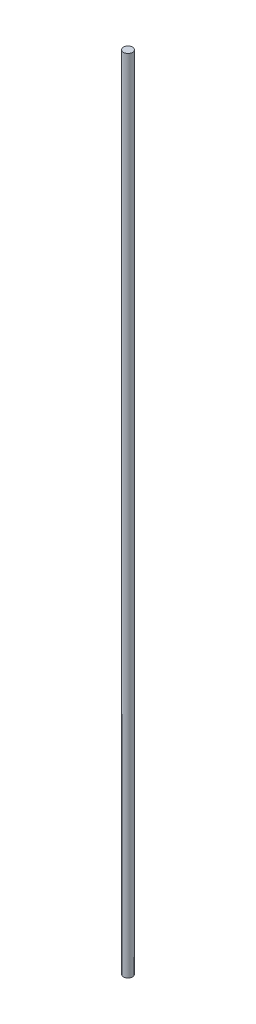
ISO-10303-21;
HEADER;
FILE_DESCRIPTION(('STEP AP214'),'2;1');
FILE_NAME('part.step','',(''),(''),'','','');
FILE_SCHEMA(('AUTOMOTIVE_DESIGN { 1 0 10303 214 1 1 1 1 }'));
ENDSEC;
DATA;
#1=APPLICATION_CONTEXT('core data for automotive mechanical design processes');
#2=APPLICATION_PROTOCOL_DEFINITION('international standard','automotive_design',2000,#1);
#3=PRODUCT_CONTEXT('',#1,'mechanical');
#4=PRODUCT('Part','Part','',(#3));
#5=PRODUCT_RELATED_PRODUCT_CATEGORY('part','',(#4));
#6=PRODUCT_DEFINITION_FORMATION('','',#4);
#7=PRODUCT_DEFINITION_CONTEXT('part definition',#1,'design');
#8=PRODUCT_DEFINITION('design','',#6,#7);
#9=PRODUCT_DEFINITION_SHAPE('','',#8);
#10=(LENGTH_UNIT() NAMED_UNIT(*) SI_UNIT(.MILLI.,.METRE.));
#11=(NAMED_UNIT(*) PLANE_ANGLE_UNIT() SI_UNIT($,.RADIAN.));
#12=(NAMED_UNIT(*) SI_UNIT($,.STERADIAN.) SOLID_ANGLE_UNIT());
#13=UNCERTAINTY_MEASURE_WITH_UNIT(LENGTH_MEASURE(1.E-05),#10,'distance_accuracy_value','');
#14=(GEOMETRIC_REPRESENTATION_CONTEXT(3) GLOBAL_UNCERTAINTY_ASSIGNED_CONTEXT((#13)) GLOBAL_UNIT_ASSIGNED_CONTEXT((#10,
#11,#12)) REPRESENTATION_CONTEXT('',''));
#15=CARTESIAN_POINT('',(0.,0.,0.));
#16=DIRECTION('',(0.,0.,1.));
#17=DIRECTION('',(1.,0.,0.));
#18=AXIS2_PLACEMENT_3D('',#15,#16,#17);
#19=CARTESIAN_POINT('',(0.,700.,0.));
#20=DIRECTION('',(0.,-1.,0.));
#21=DIRECTION('',(0.,0.,-1.));
#22=AXIS2_PLACEMENT_3D('',#19,#20,#21);
#23=CYLINDRICAL_SURFACE('',#22,4.);
#24=CARTESIAN_POINT('',(0.,700.,0.));
#25=DIRECTION('',(0.,1.,0.));
#26=DIRECTION('',(0.,0.,1.));
#27=AXIS2_PLACEMENT_3D('',#24,#25,#26);
#28=CIRCLE('',#27,4.);
#29=CARTESIAN_POINT('',(0.,700.,4.));
#30=VERTEX_POINT('',#29);
#31=EDGE_CURVE('E10',#30,#30,#28,.T.);
#32=ORIENTED_EDGE('',*,*,#31,.F.);
#33=EDGE_LOOP('',(#32));
#34=FACE_BOUND('',#33,.T.);
#35=CARTESIAN_POINT('',(0.,0.,0.));
#36=DIRECTION('',(0.,1.,0.));
#37=DIRECTION('',(0.,0.,1.));
#38=AXIS2_PLACEMENT_3D('',#35,#36,#37);
#39=CIRCLE('',#38,4.);
#40=CARTESIAN_POINT('',(0.,0.,4.));
#41=VERTEX_POINT('',#40);
#42=EDGE_CURVE('E36',#41,#41,#39,.T.);
#43=ORIENTED_EDGE('',*,*,#42,.T.);
#44=EDGE_LOOP('',(#43));
#45=FACE_BOUND('',#44,.T.);
#46=ADVANCED_FACE('F33',(#34,#45),#23,.T.);
#47=CARTESIAN_POINT('',(0.,700.,0.));
#48=DIRECTION('',(0.,1.,0.));
#49=DIRECTION('',(0.,0.,1.));
#50=AXIS2_PLACEMENT_3D('',#47,#48,#49);
#51=PLANE('',#50);
#52=ORIENTED_EDGE('',*,*,#31,.T.);
#53=EDGE_LOOP('',(#52));
#54=FACE_BOUND('',#53,.T.);
#55=ADVANCED_FACE('F48',(#54),#51,.T.);
#56=CARTESIAN_POINT('',(0.,0.,0.));
#57=DIRECTION('',(0.,1.,0.));
#58=DIRECTION('',(0.,0.,1.));
#59=AXIS2_PLACEMENT_3D('',#56,#57,#58);
#60=PLANE('',#59);
#61=ORIENTED_EDGE('',*,*,#42,.F.);
#62=EDGE_LOOP('',(#61));
#63=FACE_BOUND('',#62,.T.);
#64=ADVANCED_FACE('F46',(#63),#60,.F.);
#65=CLOSED_SHELL('',(#46,#55,#64));
#66=MANIFOLD_SOLID_BREP('B2',#65);
#67=ADVANCED_BREP_SHAPE_REPRESENTATION('',(#18,#66),#14);
#68=SHAPE_DEFINITION_REPRESENTATION(#9,#67);
ENDSEC;
END-ISO-10303-21;
